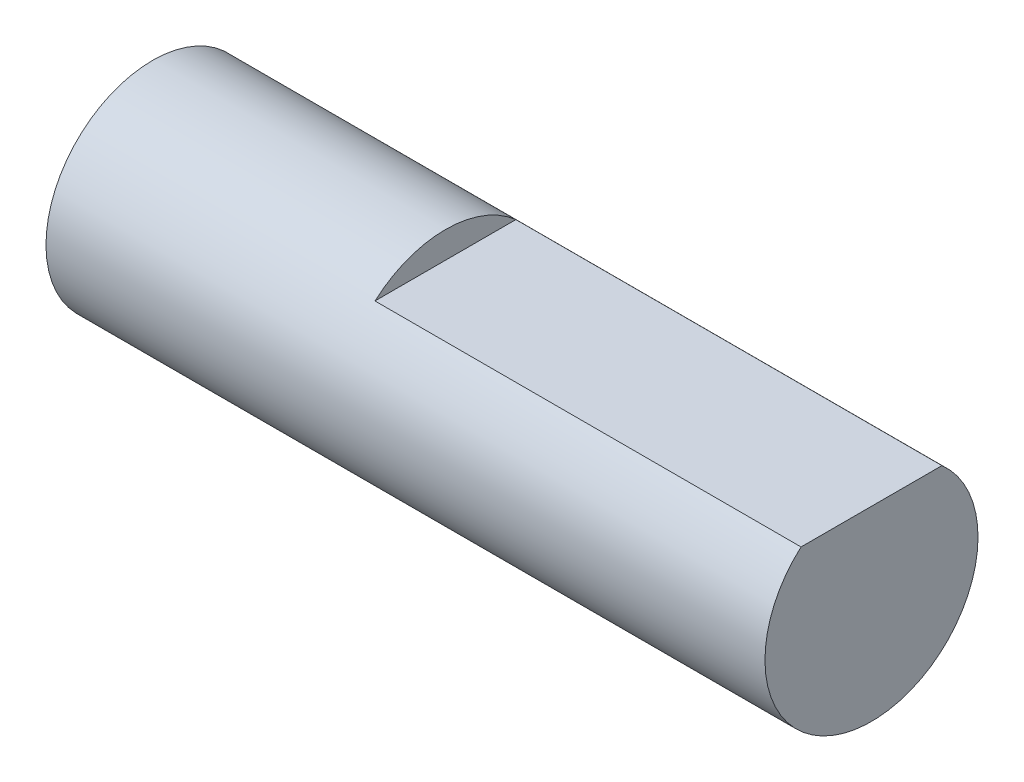
ISO-10303-21;
HEADER;
FILE_DESCRIPTION(('STEP AP214'),'2;1');
FILE_NAME('part.step','',(''),(''),'','','');
FILE_SCHEMA(('AUTOMOTIVE_DESIGN { 1 0 10303 214 1 1 1 1 }'));
ENDSEC;
DATA;
#1=APPLICATION_CONTEXT('core data for automotive mechanical design processes');
#2=APPLICATION_PROTOCOL_DEFINITION('international standard','automotive_design',2000,#1);
#3=PRODUCT_CONTEXT('',#1,'mechanical');
#4=PRODUCT('Part','Part','',(#3));
#5=PRODUCT_RELATED_PRODUCT_CATEGORY('part','',(#4));
#6=PRODUCT_DEFINITION_FORMATION('','',#4);
#7=PRODUCT_DEFINITION_CONTEXT('part definition',#1,'design');
#8=PRODUCT_DEFINITION('design','',#6,#7);
#9=PRODUCT_DEFINITION_SHAPE('','',#8);
#10=(LENGTH_UNIT() NAMED_UNIT(*) SI_UNIT(.MILLI.,.METRE.));
#11=(NAMED_UNIT(*) PLANE_ANGLE_UNIT() SI_UNIT($,.RADIAN.));
#12=(NAMED_UNIT(*) SI_UNIT($,.STERADIAN.) SOLID_ANGLE_UNIT());
#13=UNCERTAINTY_MEASURE_WITH_UNIT(LENGTH_MEASURE(1.E-05),#10,'distance_accuracy_value','');
#14=(GEOMETRIC_REPRESENTATION_CONTEXT(3) GLOBAL_UNCERTAINTY_ASSIGNED_CONTEXT((#13)) GLOBAL_UNIT_ASSIGNED_CONTEXT((#10,
#11,#12)) REPRESENTATION_CONTEXT('',''));
#15=CARTESIAN_POINT('',(0.,0.,0.));
#16=DIRECTION('',(0.,0.,1.));
#17=DIRECTION('',(1.,0.,0.));
#18=AXIS2_PLACEMENT_3D('',#15,#16,#17);
#19=CARTESIAN_POINT('',(27.,0.,0.));
#20=DIRECTION('',(-1.,0.,0.));
#21=DIRECTION('',(0.,0.,1.));
#22=AXIS2_PLACEMENT_3D('',#19,#20,#21);
#23=CYLINDRICAL_SURFACE('',#22,4.);
#24=CARTESIAN_POINT('',(27.,0.,0.));
#25=DIRECTION('',(1.,0.,0.));
#26=DIRECTION('',(0.,0.,-1.));
#27=AXIS2_PLACEMENT_3D('',#24,#25,#26);
#28=CIRCLE('',#27,4.);
#29=CARTESIAN_POINT('',(27.,3.,2.64575131106459));
#30=VERTEX_POINT('',#29);
#31=CARTESIAN_POINT('',(27.,3.,-2.64575131106459));
#32=VERTEX_POINT('',#31);
#33=EDGE_CURVE('E11',#30,#32,#28,.T.);
#34=ORIENTED_EDGE('',*,*,#33,.F.);
#35=DIRECTION('',(-1.,0.,0.));
#36=VECTOR('',#35,1.);
#37=CARTESIAN_POINT('',(63.5932029207611,3.,2.64575131106459));
#38=LINE('',#37,#36);
#39=CARTESIAN_POINT('',(11.,3.,2.64575131106459));
#40=VERTEX_POINT('',#39);
#41=EDGE_CURVE('E71',#30,#40,#38,.T.);
#42=ORIENTED_EDGE('',*,*,#41,.T.);
#43=CARTESIAN_POINT('',(11.,0.,0.));
#44=DIRECTION('',(1.,0.,0.));
#45=DIRECTION('',(0.,0.,-1.));
#46=AXIS2_PLACEMENT_3D('',#43,#44,#45);
#47=CIRCLE('',#46,4.);
#48=CARTESIAN_POINT('',(11.,3.,-2.64575131106459));
#49=VERTEX_POINT('',#48);
#50=EDGE_CURVE('E59',#49,#40,#47,.T.);
#51=ORIENTED_EDGE('',*,*,#50,.F.);
#52=DIRECTION('',(-1.,0.,0.));
#53=VECTOR('',#52,1.);
#54=CARTESIAN_POINT('',(63.5932029207611,3.,-2.64575131106459));
#55=LINE('',#54,#53);
#56=EDGE_CURVE('E75',#32,#49,#55,.T.);
#57=ORIENTED_EDGE('',*,*,#56,.F.);
#58=EDGE_LOOP('',(#34,#42,#51,#57));
#59=FACE_BOUND('',#58,.T.);
#60=CARTESIAN_POINT('',(0.,0.,0.));
#61=DIRECTION('',(1.,0.,0.));
#62=DIRECTION('',(0.,0.,-1.));
#63=AXIS2_PLACEMENT_3D('',#60,#61,#62);
#64=CIRCLE('',#63,4.);
#65=CARTESIAN_POINT('',(0.,0.,-4.));
#66=VERTEX_POINT('',#65);
#67=EDGE_CURVE('E48',#66,#66,#64,.T.);
#68=ORIENTED_EDGE('',*,*,#67,.T.);
#69=EDGE_LOOP('',(#68));
#70=FACE_BOUND('',#69,.T.);
#71=ADVANCED_FACE('F45',(#59,#70),#23,.T.);
#72=CARTESIAN_POINT('',(27.,0.,0.));
#73=DIRECTION('',(1.,0.,0.));
#74=DIRECTION('',(0.,0.,-1.));
#75=AXIS2_PLACEMENT_3D('',#72,#73,#74);
#76=PLANE('',#75);
#77=DIRECTION('',(0.,0.,-1.));
#78=VECTOR('',#77,1.);
#79=CARTESIAN_POINT('',(27.,3.,2.64575131106459));
#80=LINE('',#79,#78);
#81=EDGE_CURVE('E65',#30,#32,#80,.T.);
#82=ORIENTED_EDGE('',*,*,#81,.F.);
#83=ORIENTED_EDGE('',*,*,#33,.T.);
#84=EDGE_LOOP('',(#82,#83));
#85=FACE_BOUND('',#84,.T.);
#86=ADVANCED_FACE('F91',(#85),#76,.T.);
#87=CARTESIAN_POINT('',(0.,0.,0.));
#88=DIRECTION('',(1.,0.,0.));
#89=DIRECTION('',(0.,0.,-1.));
#90=AXIS2_PLACEMENT_3D('',#87,#88,#89);
#91=PLANE('',#90);
#92=ORIENTED_EDGE('',*,*,#67,.F.);
#93=EDGE_LOOP('',(#92));
#94=FACE_BOUND('',#93,.T.);
#95=ADVANCED_FACE('F89',(#94),#91,.F.);
#96=CARTESIAN_POINT('',(63.5932029207611,3.,2.64575131106459));
#97=DIRECTION('',(0.,1.,0.));
#98=DIRECTION('',(0.,0.,1.));
#99=AXIS2_PLACEMENT_3D('',#96,#97,#98);
#100=PLANE('',#99);
#101=ORIENTED_EDGE('',*,*,#41,.F.);
#102=ORIENTED_EDGE('',*,*,#81,.T.);
#103=ORIENTED_EDGE('',*,*,#56,.T.);
#104=DIRECTION('',(0.,0.,-1.));
#105=VECTOR('',#104,1.);
#106=CARTESIAN_POINT('',(11.,3.,2.64575131106459));
#107=LINE('',#106,#105);
#108=EDGE_CURVE('E79',#40,#49,#107,.T.);
#109=ORIENTED_EDGE('',*,*,#108,.F.);
#110=EDGE_LOOP('',(#101,#102,#103,#109));
#111=FACE_BOUND('',#110,.T.);
#112=ADVANCED_FACE('F82',(#111),#100,.T.);
#113=CARTESIAN_POINT('',(11.,0.,0.));
#114=DIRECTION('',(1.,0.,0.));
#115=DIRECTION('',(0.,0.,-1.));
#116=AXIS2_PLACEMENT_3D('',#113,#114,#115);
#117=PLANE('',#116);
#118=ORIENTED_EDGE('',*,*,#108,.T.);
#119=ORIENTED_EDGE('',*,*,#50,.T.);
#120=EDGE_LOOP('',(#118,#119));
#121=FACE_BOUND('',#120,.T.);
#122=ADVANCED_FACE('F78',(#121),#117,.T.);
#123=CLOSED_SHELL('',(#71,#86,#95,#112,#122));
#124=MANIFOLD_SOLID_BREP('B2',#123);
#125=ADVANCED_BREP_SHAPE_REPRESENTATION('',(#18,#124),#14);
#126=SHAPE_DEFINITION_REPRESENTATION(#9,#125);
ENDSEC;
END-ISO-10303-21;
